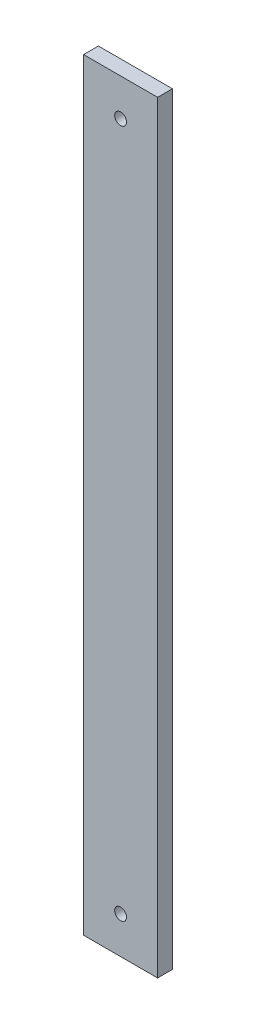
ISO-10303-21;
HEADER;
FILE_DESCRIPTION(('STEP AP214'),'2;1');
FILE_NAME('part.step','',(''),(''),'','','');
FILE_SCHEMA(('AUTOMOTIVE_DESIGN { 1 0 10303 214 1 1 1 1 }'));
ENDSEC;
DATA;
#1=APPLICATION_CONTEXT('core data for automotive mechanical design processes');
#2=APPLICATION_PROTOCOL_DEFINITION('international standard','automotive_design',2000,#1);
#3=PRODUCT_CONTEXT('',#1,'mechanical');
#4=PRODUCT('Part','Part','',(#3));
#5=PRODUCT_RELATED_PRODUCT_CATEGORY('part','',(#4));
#6=PRODUCT_DEFINITION_FORMATION('','',#4);
#7=PRODUCT_DEFINITION_CONTEXT('part definition',#1,'design');
#8=PRODUCT_DEFINITION('design','',#6,#7);
#9=PRODUCT_DEFINITION_SHAPE('','',#8);
#10=(LENGTH_UNIT() NAMED_UNIT(*) SI_UNIT(.MILLI.,.METRE.));
#11=(NAMED_UNIT(*) PLANE_ANGLE_UNIT() SI_UNIT($,.RADIAN.));
#12=(NAMED_UNIT(*) SI_UNIT($,.STERADIAN.) SOLID_ANGLE_UNIT());
#13=UNCERTAINTY_MEASURE_WITH_UNIT(LENGTH_MEASURE(1.E-05),#10,'distance_accuracy_value','');
#14=(GEOMETRIC_REPRESENTATION_CONTEXT(3) GLOBAL_UNCERTAINTY_ASSIGNED_CONTEXT((#13)) GLOBAL_UNIT_ASSIGNED_CONTEXT((#10,
#11,#12)) REPRESENTATION_CONTEXT('',''));
#15=CARTESIAN_POINT('',(0.,0.,0.));
#16=DIRECTION('',(0.,0.,1.));
#17=DIRECTION('',(1.,0.,0.));
#18=AXIS2_PLACEMENT_3D('',#15,#16,#17);
#19=CARTESIAN_POINT('',(0.,0.,4.));
#20=DIRECTION('',(0.,0.,1.));
#21=DIRECTION('',(1.,0.,0.));
#22=AXIS2_PLACEMENT_3D('',#19,#20,#21);
#23=PLANE('',#22);
#24=CARTESIAN_POINT('',(0.,93.,4.));
#25=DIRECTION('',(0.,0.,1.));
#26=DIRECTION('',(1.,0.,0.));
#27=AXIS2_PLACEMENT_3D('',#24,#25,#26);
#28=CIRCLE('',#27,1.6);
#29=CARTESIAN_POINT('',(1.6,93.,4.));
#30=VERTEX_POINT('',#29);
#31=EDGE_CURVE('E103',#30,#30,#28,.T.);
#32=ORIENTED_EDGE('',*,*,#31,.F.);
#33=EDGE_LOOP('',(#32));
#34=FACE_BOUND('',#33,.T.);
#35=DIRECTION('',(0.,1.,0.));
#36=VECTOR('',#35,1.);
#37=CARTESIAN_POINT('',(10.,103.,4.));
#38=LINE('',#37,#36);
#39=CARTESIAN_POINT('',(10.,-103.,4.));
#40=VERTEX_POINT('',#39);
#41=CARTESIAN_POINT('',(10.,103.,4.));
#42=VERTEX_POINT('',#41);
#43=EDGE_CURVE('E88',#40,#42,#38,.T.);
#44=ORIENTED_EDGE('',*,*,#43,.T.);
#45=DIRECTION('',(-1.,0.,0.));
#46=VECTOR('',#45,1.);
#47=CARTESIAN_POINT('',(-10.,103.,4.));
#48=LINE('',#47,#46);
#49=CARTESIAN_POINT('',(-10.,103.,4.));
#50=VERTEX_POINT('',#49);
#51=EDGE_CURVE('E83',#42,#50,#48,.T.);
#52=ORIENTED_EDGE('',*,*,#51,.T.);
#53=DIRECTION('',(0.,-1.,0.));
#54=VECTOR('',#53,1.);
#55=CARTESIAN_POINT('',(-10.,103.,4.));
#56=LINE('',#55,#54);
#57=CARTESIAN_POINT('',(-10.,-103.,4.));
#58=VERTEX_POINT('',#57);
#59=EDGE_CURVE('E86',#50,#58,#56,.T.);
#60=ORIENTED_EDGE('',*,*,#59,.T.);
#61=DIRECTION('',(1.,0.,0.));
#62=VECTOR('',#61,1.);
#63=CARTESIAN_POINT('',(-10.,-103.,4.));
#64=LINE('',#63,#62);
#65=EDGE_CURVE('E53',#58,#40,#64,.T.);
#66=ORIENTED_EDGE('',*,*,#65,.T.);
#67=EDGE_LOOP('',(#44,#52,#60,#66));
#68=FACE_BOUND('',#67,.T.);
#69=CARTESIAN_POINT('',(0.,-93.,4.));
#70=DIRECTION('',(0.,0.,1.));
#71=DIRECTION('',(-1.,0.,0.));
#72=AXIS2_PLACEMENT_3D('',#69,#70,#71);
#73=CIRCLE('',#72,1.6);
#74=CARTESIAN_POINT('',(-1.6,-93.,4.));
#75=VERTEX_POINT('',#74);
#76=EDGE_CURVE('E118',#75,#75,#73,.T.);
#77=ORIENTED_EDGE('',*,*,#76,.F.);
#78=EDGE_LOOP('',(#77));
#79=FACE_BOUND('',#78,.T.);
#80=ADVANCED_FACE('F36',(#34,#68,#79),#23,.T.);
#81=CARTESIAN_POINT('',(0.,0.,0.));
#82=DIRECTION('',(0.,0.,1.));
#83=DIRECTION('',(1.,0.,0.));
#84=AXIS2_PLACEMENT_3D('',#81,#82,#83);
#85=PLANE('',#84);
#86=DIRECTION('',(0.,1.,0.));
#87=VECTOR('',#86,1.);
#88=CARTESIAN_POINT('',(10.,103.,0.));
#89=LINE('',#88,#87);
#90=CARTESIAN_POINT('',(10.,-103.,0.));
#91=VERTEX_POINT('',#90);
#92=CARTESIAN_POINT('',(10.,103.,0.));
#93=VERTEX_POINT('',#92);
#94=EDGE_CURVE('E100',#91,#93,#89,.T.);
#95=ORIENTED_EDGE('',*,*,#94,.F.);
#96=DIRECTION('',(1.,0.,0.));
#97=VECTOR('',#96,1.);
#98=CARTESIAN_POINT('',(-10.,-103.,0.));
#99=LINE('',#98,#97);
#100=CARTESIAN_POINT('',(-10.,-103.,0.));
#101=VERTEX_POINT('',#100);
#102=EDGE_CURVE('E76',#101,#91,#99,.T.);
#103=ORIENTED_EDGE('',*,*,#102,.F.);
#104=DIRECTION('',(0.,-1.,0.));
#105=VECTOR('',#104,1.);
#106=CARTESIAN_POINT('',(-10.,103.,0.));
#107=LINE('',#106,#105);
#108=CARTESIAN_POINT('',(-10.,103.,0.));
#109=VERTEX_POINT('',#108);
#110=EDGE_CURVE('E70',#109,#101,#107,.T.);
#111=ORIENTED_EDGE('',*,*,#110,.F.);
#112=DIRECTION('',(-1.,0.,0.));
#113=VECTOR('',#112,1.);
#114=CARTESIAN_POINT('',(-10.,103.,0.));
#115=LINE('',#114,#113);
#116=EDGE_CURVE('E92',#93,#109,#115,.T.);
#117=ORIENTED_EDGE('',*,*,#116,.F.);
#118=EDGE_LOOP('',(#95,#103,#111,#117));
#119=FACE_BOUND('',#118,.T.);
#120=CARTESIAN_POINT('',(0.,93.,0.));
#121=DIRECTION('',(0.,0.,1.));
#122=DIRECTION('',(1.,0.,0.));
#123=AXIS2_PLACEMENT_3D('',#120,#121,#122);
#124=CIRCLE('',#123,1.6);
#125=CARTESIAN_POINT('',(1.6,93.,0.));
#126=VERTEX_POINT('',#125);
#127=EDGE_CURVE('E115',#126,#126,#124,.T.);
#128=ORIENTED_EDGE('',*,*,#127,.T.);
#129=EDGE_LOOP('',(#128));
#130=FACE_BOUND('',#129,.T.);
#131=CARTESIAN_POINT('',(0.,-93.,0.));
#132=DIRECTION('',(0.,0.,1.));
#133=DIRECTION('',(-1.,0.,0.));
#134=AXIS2_PLACEMENT_3D('',#131,#132,#133);
#135=CIRCLE('',#134,1.6);
#136=CARTESIAN_POINT('',(-1.6,-93.,0.));
#137=VERTEX_POINT('',#136);
#138=EDGE_CURVE('E121',#137,#137,#135,.T.);
#139=ORIENTED_EDGE('',*,*,#138,.T.);
#140=EDGE_LOOP('',(#139));
#141=FACE_BOUND('',#140,.T.);
#142=ADVANCED_FACE('F111',(#119,#130,#141),#85,.F.);
#143=CARTESIAN_POINT('',(10.,103.,4.));
#144=DIRECTION('',(-1.,0.,0.));
#145=DIRECTION('',(0.,0.,1.));
#146=AXIS2_PLACEMENT_3D('',#143,#144,#145);
#147=PLANE('',#146);
#148=ORIENTED_EDGE('',*,*,#94,.T.);
#149=DIRECTION('',(0.,0.,-1.));
#150=VECTOR('',#149,1.);
#151=CARTESIAN_POINT('',(10.,103.,4.));
#152=LINE('',#151,#150);
#153=EDGE_CURVE('E11',#42,#93,#152,.T.);
#154=ORIENTED_EDGE('',*,*,#153,.F.);
#155=ORIENTED_EDGE('',*,*,#43,.F.);
#156=DIRECTION('',(0.,0.,-1.));
#157=VECTOR('',#156,1.);
#158=CARTESIAN_POINT('',(10.,-103.,4.));
#159=LINE('',#158,#157);
#160=EDGE_CURVE('E96',#40,#91,#159,.T.);
#161=ORIENTED_EDGE('',*,*,#160,.T.);
#162=EDGE_LOOP('',(#148,#154,#155,#161));
#163=FACE_BOUND('',#162,.T.);
#164=ADVANCED_FACE('F38',(#163),#147,.F.);
#165=CARTESIAN_POINT('',(-10.,103.,4.));
#166=DIRECTION('',(0.,-1.,0.));
#167=DIRECTION('',(0.,0.,-1.));
#168=AXIS2_PLACEMENT_3D('',#165,#166,#167);
#169=PLANE('',#168);
#170=ORIENTED_EDGE('',*,*,#116,.T.);
#171=DIRECTION('',(0.,0.,-1.));
#172=VECTOR('',#171,1.);
#173=CARTESIAN_POINT('',(-10.,103.,4.));
#174=LINE('',#173,#172);
#175=EDGE_CURVE('E45',#50,#109,#174,.T.);
#176=ORIENTED_EDGE('',*,*,#175,.F.);
#177=ORIENTED_EDGE('',*,*,#51,.F.);
#178=ORIENTED_EDGE('',*,*,#153,.T.);
#179=EDGE_LOOP('',(#170,#176,#177,#178));
#180=FACE_BOUND('',#179,.T.);
#181=ADVANCED_FACE('F91',(#180),#169,.F.);
#182=CARTESIAN_POINT('',(-10.,103.,4.));
#183=DIRECTION('',(1.,0.,0.));
#184=DIRECTION('',(0.,1.,0.));
#185=AXIS2_PLACEMENT_3D('',#182,#183,#184);
#186=PLANE('',#185);
#187=ORIENTED_EDGE('',*,*,#110,.T.);
#188=DIRECTION('',(0.,0.,-1.));
#189=VECTOR('',#188,1.);
#190=CARTESIAN_POINT('',(-10.,-103.,4.));
#191=LINE('',#190,#189);
#192=EDGE_CURVE('E93',#58,#101,#191,.T.);
#193=ORIENTED_EDGE('',*,*,#192,.F.);
#194=ORIENTED_EDGE('',*,*,#59,.F.);
#195=ORIENTED_EDGE('',*,*,#175,.T.);
#196=EDGE_LOOP('',(#187,#193,#194,#195));
#197=FACE_BOUND('',#196,.T.);
#198=ADVANCED_FACE('F94',(#197),#186,.F.);
#199=CARTESIAN_POINT('',(-10.,-103.,4.));
#200=DIRECTION('',(0.,1.,0.));
#201=DIRECTION('',(0.,0.,1.));
#202=AXIS2_PLACEMENT_3D('',#199,#200,#201);
#203=PLANE('',#202);
#204=ORIENTED_EDGE('',*,*,#102,.T.);
#205=ORIENTED_EDGE('',*,*,#160,.F.);
#206=ORIENTED_EDGE('',*,*,#65,.F.);
#207=ORIENTED_EDGE('',*,*,#192,.T.);
#208=EDGE_LOOP('',(#204,#205,#206,#207));
#209=FACE_BOUND('',#208,.T.);
#210=ADVANCED_FACE('F108',(#209),#203,.F.);
#211=CARTESIAN_POINT('',(0.,93.,4.));
#212=DIRECTION('',(0.,0.,-1.));
#213=DIRECTION('',(-1.,0.,0.));
#214=AXIS2_PLACEMENT_3D('',#211,#212,#213);
#215=CYLINDRICAL_SURFACE('',#214,1.6);
#216=ORIENTED_EDGE('',*,*,#31,.T.);
#217=EDGE_LOOP('',(#216));
#218=FACE_BOUND('',#217,.T.);
#219=ORIENTED_EDGE('',*,*,#127,.F.);
#220=EDGE_LOOP('',(#219));
#221=FACE_BOUND('',#220,.T.);
#222=ADVANCED_FACE('F138',(#218,#221),#215,.F.);
#223=CARTESIAN_POINT('',(0.,-93.,4.));
#224=DIRECTION('',(0.,0.,-1.));
#225=DIRECTION('',(-1.,0.,0.));
#226=AXIS2_PLACEMENT_3D('',#223,#224,#225);
#227=CYLINDRICAL_SURFACE('',#226,1.6);
#228=ORIENTED_EDGE('',*,*,#76,.T.);
#229=EDGE_LOOP('',(#228));
#230=FACE_BOUND('',#229,.T.);
#231=ORIENTED_EDGE('',*,*,#138,.F.);
#232=EDGE_LOOP('',(#231));
#233=FACE_BOUND('',#232,.T.);
#234=ADVANCED_FACE('F127',(#230,#233),#227,.F.);
#235=CLOSED_SHELL('',(#80,#142,#164,#181,#198,#210,#222,#234));
#236=MANIFOLD_SOLID_BREP('B2',#235);
#237=ADVANCED_BREP_SHAPE_REPRESENTATION('',(#18,#236),#14);
#238=SHAPE_DEFINITION_REPRESENTATION(#9,#237);
ENDSEC;
END-ISO-10303-21;
